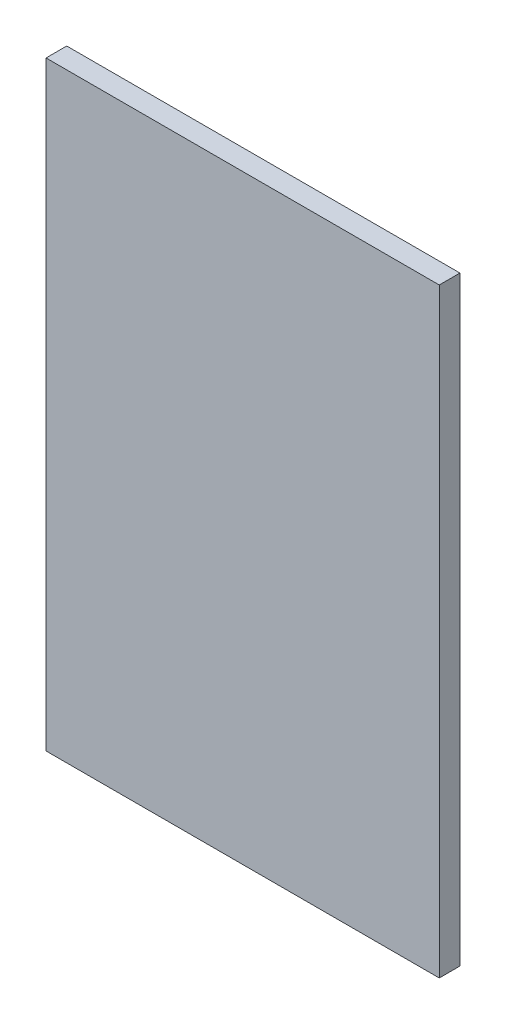
ISO-10303-21;
HEADER;
FILE_DESCRIPTION(('STEP AP214'),'2;1');
FILE_NAME('part.step','',(''),(''),'','','');
FILE_SCHEMA(('AUTOMOTIVE_DESIGN { 1 0 10303 214 1 1 1 1 }'));
ENDSEC;
DATA;
#1=APPLICATION_CONTEXT('core data for automotive mechanical design processes');
#2=APPLICATION_PROTOCOL_DEFINITION('international standard','automotive_design',2000,#1);
#3=PRODUCT_CONTEXT('',#1,'mechanical');
#4=PRODUCT('Part','Part','',(#3));
#5=PRODUCT_RELATED_PRODUCT_CATEGORY('part','',(#4));
#6=PRODUCT_DEFINITION_FORMATION('','',#4);
#7=PRODUCT_DEFINITION_CONTEXT('part definition',#1,'design');
#8=PRODUCT_DEFINITION('design','',#6,#7);
#9=PRODUCT_DEFINITION_SHAPE('','',#8);
#10=(LENGTH_UNIT() NAMED_UNIT(*) SI_UNIT(.MILLI.,.METRE.));
#11=(NAMED_UNIT(*) PLANE_ANGLE_UNIT() SI_UNIT($,.RADIAN.));
#12=(NAMED_UNIT(*) SI_UNIT($,.STERADIAN.) SOLID_ANGLE_UNIT());
#13=UNCERTAINTY_MEASURE_WITH_UNIT(LENGTH_MEASURE(1.E-05),#10,'distance_accuracy_value','');
#14=(GEOMETRIC_REPRESENTATION_CONTEXT(3) GLOBAL_UNCERTAINTY_ASSIGNED_CONTEXT((#13)) GLOBAL_UNIT_ASSIGNED_CONTEXT((#10,
#11,#12)) REPRESENTATION_CONTEXT('',''));
#15=CARTESIAN_POINT('',(0.,0.,0.));
#16=DIRECTION('',(0.,0.,1.));
#17=DIRECTION('',(1.,0.,0.));
#18=AXIS2_PLACEMENT_3D('',#15,#16,#17);
#19=CARTESIAN_POINT('',(-2.525000628309,4.724999362948,-2.111602004566));
#20=DIRECTION('',(0.,8.74227765734797E-08,-0.999999999999996));
#21=DIRECTION('',(0.,0.999999999999996,8.74227765734797E-08));
#22=AXIS2_PLACEMENT_3D('',#19,#20,#21);
#23=PLANE('',#22);
#24=DIRECTION('',(0.999999999999999,-4.37113882867396E-08,0.));
#25=VECTOR('',#24,1.);
#26=CARTESIAN_POINT('',(-2.525000691691,3.27499936294814,-2.111602131329));
#27=LINE('',#26,#25);
#28=CARTESIAN_POINT('',(-3.47500069169088,3.27499938371099,-2.11160209963826));
#29=VERTEX_POINT('',#28);
#30=CARTESIAN_POINT('',(-2.52500067584526,3.27499936294803,-2.11160206794751));
#31=VERTEX_POINT('',#30);
#32=EDGE_CURVE('E76',#29,#31,#27,.T.);
#33=ORIENTED_EDGE('',*,*,#32,.F.);
#34=DIRECTION('',(-4.371138828674E-08,-0.999999999999999,0.));
#35=VECTOR('',#34,1.);
#36=CARTESIAN_POINT('',(-3.475000628309,4.724999400103,-2.111602004566));
#37=LINE('',#36,#35);
#38=CARTESIAN_POINT('',(-3.4750006441545,4.72499940338123,-2.111602004566));
#39=VERTEX_POINT('',#38);
#40=EDGE_CURVE('E58',#39,#29,#37,.T.);
#41=ORIENTED_EDGE('',*,*,#40,.F.);
#42=DIRECTION('',(0.999999999999999,-4.37113882867396E-08,0.));
#43=VECTOR('',#42,1.);
#44=CARTESIAN_POINT('',(-2.525000628309,4.72499936294814,-2.111602004566));
#45=LINE('',#44,#43);
#46=CARTESIAN_POINT('',(-2.525000628309,4.72499937223682,-2.111602004566));
#47=VERTEX_POINT('',#46);
#48=EDGE_CURVE('E20',#39,#47,#45,.T.);
#49=ORIENTED_EDGE('',*,*,#48,.T.);
#50=DIRECTION('',(-4.371138828674E-08,-0.999999999999999,0.));
#51=VECTOR('',#50,1.);
#52=CARTESIAN_POINT('',(-2.525000628309,4.724999358577,-2.111602004566));
#53=LINE('',#52,#51);
#54=EDGE_CURVE('E55',#47,#31,#53,.T.);
#55=ORIENTED_EDGE('',*,*,#54,.T.);
#56=EDGE_LOOP('',(#33,#41,#49,#55));
#57=FACE_BOUND('',#56,.T.);
#58=ADVANCED_FACE('F17',(#57),#23,.T.);
#59=CARTESIAN_POINT('',(-2.525000628309,4.724999358577,-2.061602004566));
#60=DIRECTION('',(-4.37113882867398E-08,-0.999999999999995,-8.74227765734796E-08));
#61=DIRECTION('',(0.,8.74227765734797E-08,-0.999999999999996));
#62=AXIS2_PLACEMENT_3D('',#59,#60,#61);
#63=PLANE('',#62);
#64=DIRECTION('',(0.,0.,1.));
#65=VECTOR('',#64,1.);
#66=CARTESIAN_POINT('',(-3.475000628309,4.724999400103,-2.061602004566));
#67=LINE('',#66,#65);
#68=CARTESIAN_POINT('',(-3.4750006441545,4.72499940010291,-2.06160203625675));
#69=VERTEX_POINT('',#68);
#70=EDGE_CURVE('E78',#69,#39,#67,.F.);
#71=ORIENTED_EDGE('',*,*,#70,.F.);
#72=DIRECTION('',(1.,0.,0.));
#73=VECTOR('',#72,1.);
#74=CARTESIAN_POINT('',(-2.525000628309,4.724999400103,-2.061602004566));
#75=LINE('',#74,#73);
#76=CARTESIAN_POINT('',(-2.525000628309,4.7249993689585,-2.06160203625675));
#77=VERTEX_POINT('',#76);
#78=EDGE_CURVE('E73',#69,#77,#75,.T.);
#79=ORIENTED_EDGE('',*,*,#78,.T.);
#80=DIRECTION('',(0.,0.,1.));
#81=VECTOR('',#80,1.);
#82=CARTESIAN_POINT('',(-2.525000628309,4.724999358577,-2.061602004566));
#83=LINE('',#82,#81);
#84=EDGE_CURVE('E63',#77,#47,#83,.F.);
#85=ORIENTED_EDGE('',*,*,#84,.T.);
#86=ORIENTED_EDGE('',*,*,#48,.F.);
#87=EDGE_LOOP('',(#71,#79,#85,#86));
#88=FACE_BOUND('',#87,.T.);
#89=ADVANCED_FACE('F72',(#88),#63,.F.);
#90=CARTESIAN_POINT('',(-2.525000628309,4.724999358577,-2.061602004566));
#91=DIRECTION('',(-0.999999999999999,4.371138828674E-08,0.));
#92=DIRECTION('',(-4.371138828674E-08,-0.999999999999999,0.));
#93=AXIS2_PLACEMENT_3D('',#90,#91,#92);
#94=PLANE('',#93);
#95=ORIENTED_EDGE('',*,*,#54,.F.);
#96=ORIENTED_EDGE('',*,*,#84,.F.);
#97=DIRECTION('',(0.,0.999999999999996,8.74227765734797E-08));
#98=VECTOR('',#97,1.);
#99=CARTESIAN_POINT('',(-2.525000628309,4.724999358577,-2.061602004566));
#100=LINE('',#99,#98);
#101=CARTESIAN_POINT('',(-2.52500067584526,3.2749993607625,-2.06160213132901));
#102=VERTEX_POINT('',#101);
#103=EDGE_CURVE('E83',#77,#102,#100,.F.);
#104=ORIENTED_EDGE('',*,*,#103,.T.);
#105=DIRECTION('',(0.,8.74227765734797E-08,-0.999999999999996));
#106=VECTOR('',#105,1.);
#107=CARTESIAN_POINT('',(-2.525000691691,3.274999358577,-2.061602131329));
#108=LINE('',#107,#106);
#109=EDGE_CURVE('E69',#31,#102,#108,.F.);
#110=ORIENTED_EDGE('',*,*,#109,.F.);
#111=EDGE_LOOP('',(#95,#96,#104,#110));
#112=FACE_BOUND('',#111,.T.);
#113=ADVANCED_FACE('F66',(#112),#94,.F.);
#114=CARTESIAN_POINT('',(-2.525000691691,3.274999358577,-2.061602131329));
#115=DIRECTION('',(-4.37113882867398E-08,-0.999999999999995,-8.74227765734796E-08));
#116=DIRECTION('',(0.,8.74227765734797E-08,-0.999999999999996));
#117=AXIS2_PLACEMENT_3D('',#114,#115,#116);
#118=PLANE('',#117);
#119=DIRECTION('',(0.,0.,1.));
#120=VECTOR('',#119,1.);
#121=CARTESIAN_POINT('',(-3.47500069169051,3.274999404474,-2.061602004566));
#122=LINE('',#121,#120);
#123=CARTESIAN_POINT('',(-3.47500069169088,3.27499939081416,-2.061602131329));
#124=VERTEX_POINT('',#123);
#125=EDGE_CURVE('E34',#29,#124,#122,.T.);
#126=ORIENTED_EDGE('',*,*,#125,.F.);
#127=ORIENTED_EDGE('',*,*,#32,.T.);
#128=ORIENTED_EDGE('',*,*,#109,.T.);
#129=DIRECTION('',(1.,0.,0.));
#130=VECTOR('',#129,1.);
#131=CARTESIAN_POINT('',(-2.525000628309,3.274999358577,-2.06160213132903));
#132=LINE('',#131,#130);
#133=EDGE_CURVE('E26',#102,#124,#132,.F.);
#134=ORIENTED_EDGE('',*,*,#133,.T.);
#135=EDGE_LOOP('',(#126,#127,#128,#134));
#136=FACE_BOUND('',#135,.T.);
#137=ADVANCED_FACE('F88',(#136),#118,.T.);
#138=CARTESIAN_POINT('',(-3.475000628309,4.724999400103,-2.061602004566));
#139=DIRECTION('',(-0.999999999999999,4.371138828674E-08,0.));
#140=DIRECTION('',(-4.371138828674E-08,-0.999999999999999,0.));
#141=AXIS2_PLACEMENT_3D('',#138,#139,#140);
#142=PLANE('',#141);
#143=ORIENTED_EDGE('',*,*,#40,.T.);
#144=ORIENTED_EDGE('',*,*,#125,.T.);
#145=DIRECTION('',(0.,0.999999999999996,8.74227765734797E-08));
#146=VECTOR('',#145,1.);
#147=CARTESIAN_POINT('',(-3.475000691691,4.724999358577,-2.061602004566));
#148=LINE('',#147,#146);
#149=EDGE_CURVE('E11',#124,#69,#148,.T.);
#150=ORIENTED_EDGE('',*,*,#149,.T.);
#151=ORIENTED_EDGE('',*,*,#70,.T.);
#152=EDGE_LOOP('',(#143,#144,#150,#151));
#153=FACE_BOUND('',#152,.T.);
#154=ADVANCED_FACE('F91',(#153),#142,.T.);
#155=CARTESIAN_POINT('',(-2.525000628309,4.724999358577,-2.061602004566));
#156=DIRECTION('',(0.,8.74227765734797E-08,-0.999999999999996));
#157=DIRECTION('',(0.,0.999999999999996,8.74227765734797E-08));
#158=AXIS2_PLACEMENT_3D('',#155,#156,#157);
#159=PLANE('',#158);
#160=ORIENTED_EDGE('',*,*,#133,.F.);
#161=ORIENTED_EDGE('',*,*,#103,.F.);
#162=ORIENTED_EDGE('',*,*,#78,.F.);
#163=ORIENTED_EDGE('',*,*,#149,.F.);
#164=EDGE_LOOP('',(#160,#161,#162,#163));
#165=FACE_BOUND('',#164,.T.);
#166=ADVANCED_FACE('F90',(#165),#159,.F.);
#167=CLOSED_SHELL('',(#58,#89,#113,#137,#154,#166));
#168=MANIFOLD_SOLID_BREP('B1',#167);
#169=ADVANCED_BREP_SHAPE_REPRESENTATION('',(#18,#168),#14);
#170=SHAPE_DEFINITION_REPRESENTATION(#9,#169);
ENDSEC;
END-ISO-10303-21;
